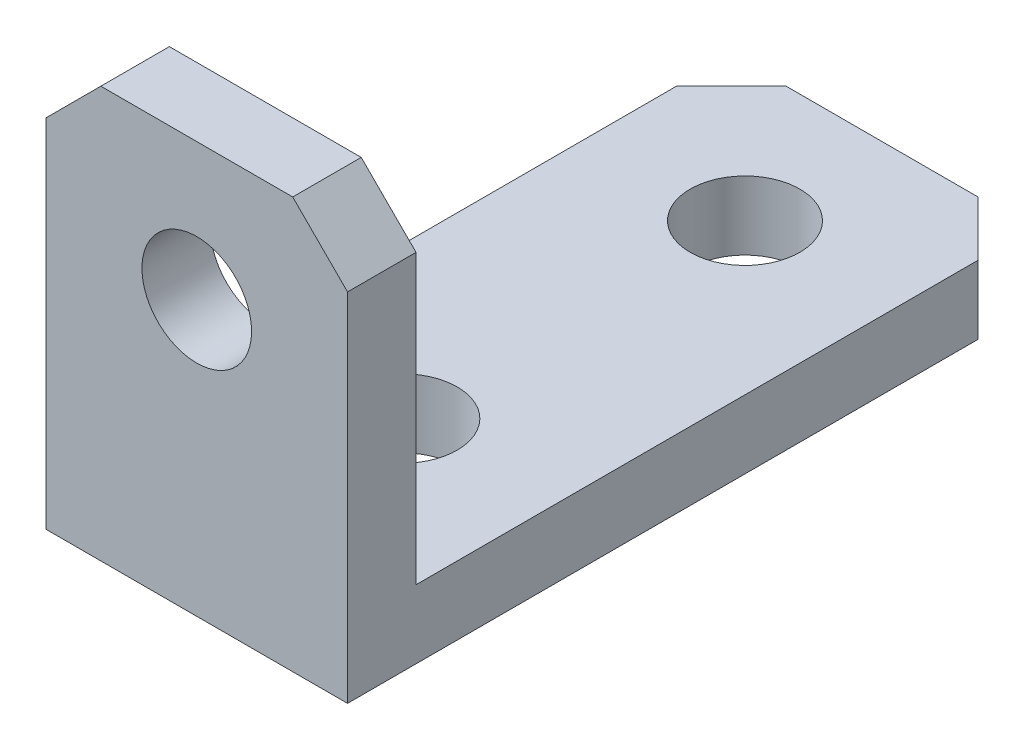
ISO-10303-21;
HEADER;
FILE_DESCRIPTION(('STEP AP214'),'2;1');
FILE_NAME('part.step','',(''),(''),'','','');
FILE_SCHEMA(('AUTOMOTIVE_DESIGN { 1 0 10303 214 1 1 1 1 }'));
ENDSEC;
DATA;
#1=APPLICATION_CONTEXT('core data for automotive mechanical design processes');
#2=APPLICATION_PROTOCOL_DEFINITION('international standard','automotive_design',2000,#1);
#3=PRODUCT_CONTEXT('',#1,'mechanical');
#4=PRODUCT('Part','Part','',(#3));
#5=PRODUCT_RELATED_PRODUCT_CATEGORY('part','',(#4));
#6=PRODUCT_DEFINITION_FORMATION('','',#4);
#7=PRODUCT_DEFINITION_CONTEXT('part definition',#1,'design');
#8=PRODUCT_DEFINITION('design','',#6,#7);
#9=PRODUCT_DEFINITION_SHAPE('','',#8);
#10=(LENGTH_UNIT() NAMED_UNIT(*) SI_UNIT(.MILLI.,.METRE.));
#11=(NAMED_UNIT(*) PLANE_ANGLE_UNIT() SI_UNIT($,.RADIAN.));
#12=(NAMED_UNIT(*) SI_UNIT($,.STERADIAN.) SOLID_ANGLE_UNIT());
#13=UNCERTAINTY_MEASURE_WITH_UNIT(LENGTH_MEASURE(1.E-05),#10,'distance_accuracy_value','');
#14=(GEOMETRIC_REPRESENTATION_CONTEXT(3) GLOBAL_UNCERTAINTY_ASSIGNED_CONTEXT((#13)) GLOBAL_UNIT_ASSIGNED_CONTEXT((#10,
#11,#12)) REPRESENTATION_CONTEXT('',''));
#15=CARTESIAN_POINT('',(0.,0.,0.));
#16=DIRECTION('',(0.,0.,1.));
#17=DIRECTION('',(1.,0.,0.));
#18=AXIS2_PLACEMENT_3D('',#15,#16,#17);
#19=CARTESIAN_POINT('',(0.,5.,0.));
#20=DIRECTION('',(0.,1.,0.));
#21=DIRECTION('',(0.,0.,1.));
#22=AXIS2_PLACEMENT_3D('',#19,#20,#21);
#23=PLANE('',#22);
#24=CARTESIAN_POINT('',(-2.01587301587299,5.,-11.1111111111111));
#25=DIRECTION('',(0.,1.,0.));
#26=DIRECTION('',(0.,0.,1.));
#27=AXIS2_PLACEMENT_3D('',#24,#25,#26);
#28=CIRCLE('',#27,4.);
#29=CARTESIAN_POINT('',(-2.01587301587299,5.,-7.1111111111111));
#30=VERTEX_POINT('',#29);
#31=EDGE_CURVE('E153',#30,#30,#28,.T.);
#32=ORIENTED_EDGE('',*,*,#31,.F.);
#33=EDGE_LOOP('',(#32));
#34=FACE_BOUND('',#33,.T.);
#35=CARTESIAN_POINT('',(-2.01587301587299,5.,13.8888888888889));
#36=DIRECTION('',(0.,1.,0.));
#37=DIRECTION('',(0.,0.,1.));
#38=AXIS2_PLACEMENT_3D('',#35,#36,#37);
#39=CIRCLE('',#38,4.);
#40=CARTESIAN_POINT('',(-2.01587301587299,5.,17.8888888888889));
#41=VERTEX_POINT('',#40);
#42=EDGE_CURVE('E147',#41,#41,#39,.T.);
#43=ORIENTED_EDGE('',*,*,#42,.F.);
#44=EDGE_LOOP('',(#43));
#45=FACE_BOUND('',#44,.T.);
#46=DIRECTION('',(-1.,0.,0.));
#47=VECTOR('',#46,1.);
#48=CARTESIAN_POINT('',(-13.015873015873,5.,-21.1111111111111));
#49=LINE('',#48,#47);
#50=CARTESIAN_POINT('',(4.98412698412702,5.,-21.1111111111111));
#51=VERTEX_POINT('',#50);
#52=CARTESIAN_POINT('',(-9.01587301587299,5.,-21.1111111111111));
#53=VERTEX_POINT('',#52);
#54=EDGE_CURVE('E160',#51,#53,#49,.T.);
#55=ORIENTED_EDGE('',*,*,#54,.T.);
#56=DIRECTION('',(0.707106781186549,0.,-0.707106781186546));
#57=VECTOR('',#56,1.);
#58=CARTESIAN_POINT('',(-15.063492063492,5.,-15.0634920634921));
#59=LINE('',#58,#57);
#60=CARTESIAN_POINT('',(-13.015873015873,5.,-17.1111111111111));
#61=VERTEX_POINT('',#60);
#62=EDGE_CURVE('E120',#53,#61,#59,.F.);
#63=ORIENTED_EDGE('',*,*,#62,.T.);
#64=DIRECTION('',(0.,0.,1.));
#65=VECTOR('',#64,1.);
#66=CARTESIAN_POINT('',(-13.015873015873,5.,-21.1111111111111));
#67=LINE('',#66,#65);
#68=CARTESIAN_POINT('',(-13.015873015873,5.,23.8888888888889));
#69=VERTEX_POINT('',#68);
#70=EDGE_CURVE('E112',#61,#69,#67,.T.);
#71=ORIENTED_EDGE('',*,*,#70,.T.);
#72=DIRECTION('',(1.,0.,0.));
#73=VECTOR('',#72,1.);
#74=CARTESIAN_POINT('',(-13.015873015873,5.,23.8888888888889));
#75=LINE('',#74,#73);
#76=CARTESIAN_POINT('',(8.98412698412701,5.,23.8888888888889));
#77=VERTEX_POINT('',#76);
#78=EDGE_CURVE('E117',#69,#77,#75,.T.);
#79=ORIENTED_EDGE('',*,*,#78,.T.);
#80=DIRECTION('',(0.,0.,-1.));
#81=VECTOR('',#80,1.);
#82=CARTESIAN_POINT('',(8.98412698412702,5.,-21.1111111111111));
#83=LINE('',#82,#81);
#84=CARTESIAN_POINT('',(8.98412698412702,5.,-17.1111111111111));
#85=VERTEX_POINT('',#84);
#86=EDGE_CURVE('E124',#77,#85,#83,.T.);
#87=ORIENTED_EDGE('',*,*,#86,.T.);
#88=DIRECTION('',(0.707106781186546,0.,0.707106781186549));
#89=VECTOR('',#88,1.);
#90=CARTESIAN_POINT('',(13.0476190476191,5.,-13.047619047619));
#91=LINE('',#90,#89);
#92=EDGE_CURVE('E188',#85,#51,#91,.F.);
#93=ORIENTED_EDGE('',*,*,#92,.T.);
#94=EDGE_LOOP('',(#55,#63,#71,#79,#87,#93));
#95=FACE_BOUND('',#94,.T.);
#96=ADVANCED_FACE('F35',(#34,#45,#95),#23,.T.);
#97=CARTESIAN_POINT('',(0.,0.,0.));
#98=DIRECTION('',(0.,1.,0.));
#99=DIRECTION('',(0.,0.,1.));
#100=AXIS2_PLACEMENT_3D('',#97,#98,#99);
#101=PLANE('',#100);
#102=DIRECTION('',(0.,0.,1.));
#103=VECTOR('',#102,1.);
#104=CARTESIAN_POINT('',(-13.015873015873,0.,-21.1111111111111));
#105=LINE('',#104,#103);
#106=CARTESIAN_POINT('',(-13.015873015873,0.,-17.1111111111111));
#107=VERTEX_POINT('',#106);
#108=CARTESIAN_POINT('',(-13.015873015873,0.,28.8888888888889));
#109=VERTEX_POINT('',#108);
#110=EDGE_CURVE('E156',#107,#109,#105,.T.);
#111=ORIENTED_EDGE('',*,*,#110,.F.);
#112=DIRECTION('',(-0.707106781186549,0.,0.707106781186546));
#113=VECTOR('',#112,1.);
#114=CARTESIAN_POINT('',(-13.015873015873,0.,-17.1111111111111));
#115=LINE('',#114,#113);
#116=CARTESIAN_POINT('',(-9.01587301587299,0.,-21.1111111111111));
#117=VERTEX_POINT('',#116);
#118=EDGE_CURVE('E181',#107,#117,#115,.F.);
#119=ORIENTED_EDGE('',*,*,#118,.T.);
#120=DIRECTION('',(-1.,0.,0.));
#121=VECTOR('',#120,1.);
#122=CARTESIAN_POINT('',(-13.015873015873,0.,-21.1111111111111));
#123=LINE('',#122,#121);
#124=CARTESIAN_POINT('',(4.98412698412702,0.,-21.1111111111111));
#125=VERTEX_POINT('',#124);
#126=EDGE_CURVE('E125',#125,#117,#123,.T.);
#127=ORIENTED_EDGE('',*,*,#126,.F.);
#128=DIRECTION('',(-0.707106781186546,0.,-0.707106781186549));
#129=VECTOR('',#128,1.);
#130=CARTESIAN_POINT('',(4.98412698412702,0.,-21.1111111111111));
#131=LINE('',#130,#129);
#132=CARTESIAN_POINT('',(8.98412698412702,0.,-17.1111111111111));
#133=VERTEX_POINT('',#132);
#134=EDGE_CURVE('E179',#125,#133,#131,.F.);
#135=ORIENTED_EDGE('',*,*,#134,.T.);
#136=DIRECTION('',(0.,0.,-1.));
#137=VECTOR('',#136,1.);
#138=CARTESIAN_POINT('',(8.98412698412702,0.,-21.1111111111111));
#139=LINE('',#138,#137);
#140=CARTESIAN_POINT('',(8.98412698412701,0.,28.8888888888889));
#141=VERTEX_POINT('',#140);
#142=EDGE_CURVE('E168',#141,#133,#139,.T.);
#143=ORIENTED_EDGE('',*,*,#142,.F.);
#144=DIRECTION('',(1.,0.,0.));
#145=VECTOR('',#144,1.);
#146=CARTESIAN_POINT('',(-13.015873015873,0.,28.8888888888889));
#147=LINE('',#146,#145);
#148=EDGE_CURVE('E165',#109,#141,#147,.T.);
#149=ORIENTED_EDGE('',*,*,#148,.F.);
#150=EDGE_LOOP('',(#111,#119,#127,#135,#143,#149));
#151=FACE_BOUND('',#150,.T.);
#152=CARTESIAN_POINT('',(-2.01587301587299,0.,-11.1111111111111));
#153=DIRECTION('',(0.,1.,0.));
#154=DIRECTION('',(0.,0.,1.));
#155=AXIS2_PLACEMENT_3D('',#152,#153,#154);
#156=CIRCLE('',#155,4.);
#157=CARTESIAN_POINT('',(-2.01587301587299,0.,-7.1111111111111));
#158=VERTEX_POINT('',#157);
#159=EDGE_CURVE('E150',#158,#158,#156,.T.);
#160=ORIENTED_EDGE('',*,*,#159,.T.);
#161=EDGE_LOOP('',(#160));
#162=FACE_BOUND('',#161,.T.);
#163=CARTESIAN_POINT('',(-2.01587301587299,0.,13.8888888888889));
#164=DIRECTION('',(0.,1.,0.));
#165=DIRECTION('',(0.,0.,1.));
#166=AXIS2_PLACEMENT_3D('',#163,#164,#165);
#167=CIRCLE('',#166,4.);
#168=CARTESIAN_POINT('',(-2.01587301587299,0.,17.8888888888889));
#169=VERTEX_POINT('',#168);
#170=EDGE_CURVE('E143',#169,#169,#167,.T.);
#171=ORIENTED_EDGE('',*,*,#170,.T.);
#172=EDGE_LOOP('',(#171));
#173=FACE_BOUND('',#172,.T.);
#174=ADVANCED_FACE('F220',(#151,#162,#173),#101,.F.);
#175=CARTESIAN_POINT('',(-13.015873015873,5.,-21.1111111111111));
#176=DIRECTION('',(1.,0.,0.));
#177=DIRECTION('',(0.,0.,-1.));
#178=AXIS2_PLACEMENT_3D('',#175,#176,#177);
#179=PLANE('',#178);
#180=ORIENTED_EDGE('',*,*,#70,.F.);
#181=DIRECTION('',(0.,-1.,0.));
#182=VECTOR('',#181,1.);
#183=CARTESIAN_POINT('',(-13.015873015873,5.,-17.1111111111111));
#184=LINE('',#183,#182);
#185=EDGE_CURVE('E177',#61,#107,#184,.T.);
#186=ORIENTED_EDGE('',*,*,#185,.T.);
#187=ORIENTED_EDGE('',*,*,#110,.T.);
#188=DIRECTION('',(0.,-1.,0.));
#189=VECTOR('',#188,1.);
#190=CARTESIAN_POINT('',(-13.015873015873,5.,28.8888888888889));
#191=LINE('',#190,#189);
#192=CARTESIAN_POINT('',(-13.015873015873,26.,28.8888888888889));
#193=VERTEX_POINT('',#192);
#194=EDGE_CURVE('E174',#193,#109,#191,.T.);
#195=ORIENTED_EDGE('',*,*,#194,.F.);
#196=DIRECTION('',(0.,0.,-1.));
#197=VECTOR('',#196,1.);
#198=CARTESIAN_POINT('',(-13.015873015873,26.,23.8888888888889));
#199=LINE('',#198,#197);
#200=CARTESIAN_POINT('',(-13.015873015873,26.,23.8888888888889));
#201=VERTEX_POINT('',#200);
#202=EDGE_CURVE('E131',#193,#201,#199,.T.);
#203=ORIENTED_EDGE('',*,*,#202,.T.);
#204=DIRECTION('',(0.,-1.,0.));
#205=VECTOR('',#204,1.);
#206=CARTESIAN_POINT('',(-13.015873015873,30.,23.8888888888889));
#207=LINE('',#206,#205);
#208=EDGE_CURVE('E127',#201,#69,#207,.T.);
#209=ORIENTED_EDGE('',*,*,#208,.T.);
#210=EDGE_LOOP('',(#180,#186,#187,#195,#203,#209));
#211=FACE_BOUND('',#210,.T.);
#212=ADVANCED_FACE('F128',(#211),#179,.F.);
#213=CARTESIAN_POINT('',(-13.015873015873,5.,28.8888888888889));
#214=DIRECTION('',(0.,0.,-1.));
#215=DIRECTION('',(-1.,0.,0.));
#216=AXIS2_PLACEMENT_3D('',#213,#214,#215);
#217=PLANE('',#216);
#218=DIRECTION('',(-1.,0.,0.));
#219=VECTOR('',#218,1.);
#220=CARTESIAN_POINT('',(8.98412698412701,30.,28.8888888888889));
#221=LINE('',#220,#219);
#222=CARTESIAN_POINT('',(4.984126984127,30.,28.8888888888889));
#223=VERTEX_POINT('',#222);
#224=CARTESIAN_POINT('',(-9.015873015873,30.,28.8888888888889));
#225=VERTEX_POINT('',#224);
#226=EDGE_CURVE('E132',#223,#225,#221,.T.);
#227=ORIENTED_EDGE('',*,*,#226,.T.);
#228=DIRECTION('',(-0.707106781186546,-0.707106781186549,0.));
#229=VECTOR('',#228,1.);
#230=CARTESIAN_POINT('',(-9.015873015873,30.,28.8888888888889));
#231=LINE('',#230,#229);
#232=EDGE_CURVE('E202',#225,#193,#231,.T.);
#233=ORIENTED_EDGE('',*,*,#232,.T.);
#234=ORIENTED_EDGE('',*,*,#194,.T.);
#235=ORIENTED_EDGE('',*,*,#148,.T.);
#236=DIRECTION('',(0.,-1.,0.));
#237=VECTOR('',#236,1.);
#238=CARTESIAN_POINT('',(8.98412698412701,5.,28.8888888888889));
#239=LINE('',#238,#237);
#240=CARTESIAN_POINT('',(8.98412698412701,26.,28.8888888888889));
#241=VERTEX_POINT('',#240);
#242=EDGE_CURVE('E162',#241,#141,#239,.T.);
#243=ORIENTED_EDGE('',*,*,#242,.F.);
#244=DIRECTION('',(-0.707106781186549,0.707106781186546,0.));
#245=VECTOR('',#244,1.);
#246=CARTESIAN_POINT('',(8.98412698412701,26.,28.8888888888889));
#247=LINE('',#246,#245);
#248=EDGE_CURVE('E200',#241,#223,#247,.T.);
#249=ORIENTED_EDGE('',*,*,#248,.T.);
#250=EDGE_LOOP('',(#227,#233,#234,#235,#243,#249));
#251=FACE_BOUND('',#250,.T.);
#252=CARTESIAN_POINT('',(-2.01587301587299,20.,28.8888888888889));
#253=DIRECTION('',(0.,0.,1.));
#254=DIRECTION('',(1.,0.,0.));
#255=AXIS2_PLACEMENT_3D('',#252,#253,#254);
#256=CIRCLE('',#255,4.);
#257=CARTESIAN_POINT('',(1.98412698412701,20.,28.8888888888889));
#258=VERTEX_POINT('',#257);
#259=EDGE_CURVE('E373',#258,#258,#256,.T.);
#260=ORIENTED_EDGE('',*,*,#259,.F.);
#261=EDGE_LOOP('',(#260));
#262=FACE_BOUND('',#261,.T.);
#263=ADVANCED_FACE('F210',(#251,#262),#217,.F.);
#264=CARTESIAN_POINT('',(8.98412698412702,5.,-21.1111111111111));
#265=DIRECTION('',(-1.,0.,0.));
#266=DIRECTION('',(0.,0.,1.));
#267=AXIS2_PLACEMENT_3D('',#264,#265,#266);
#268=PLANE('',#267);
#269=ORIENTED_EDGE('',*,*,#142,.T.);
#270=DIRECTION('',(0.,1.,0.));
#271=VECTOR('',#270,1.);
#272=CARTESIAN_POINT('',(8.98412698412702,5.,-17.1111111111111));
#273=LINE('',#272,#271);
#274=EDGE_CURVE('E194',#133,#85,#273,.T.);
#275=ORIENTED_EDGE('',*,*,#274,.T.);
#276=ORIENTED_EDGE('',*,*,#86,.F.);
#277=DIRECTION('',(0.,1.,0.));
#278=VECTOR('',#277,1.);
#279=CARTESIAN_POINT('',(8.98412698412701,5.,23.8888888888889));
#280=LINE('',#279,#278);
#281=CARTESIAN_POINT('',(8.98412698412701,26.,23.8888888888889));
#282=VERTEX_POINT('',#281);
#283=EDGE_CURVE('E136',#77,#282,#280,.T.);
#284=ORIENTED_EDGE('',*,*,#283,.T.);
#285=DIRECTION('',(0.,0.,1.));
#286=VECTOR('',#285,1.);
#287=CARTESIAN_POINT('',(8.98412698412701,26.,28.8888888888889));
#288=LINE('',#287,#286);
#289=EDGE_CURVE('E191',#282,#241,#288,.T.);
#290=ORIENTED_EDGE('',*,*,#289,.T.);
#291=ORIENTED_EDGE('',*,*,#242,.T.);
#292=EDGE_LOOP('',(#269,#275,#276,#284,#290,#291));
#293=FACE_BOUND('',#292,.T.);
#294=ADVANCED_FACE('F207',(#293),#268,.F.);
#295=CARTESIAN_POINT('',(-13.015873015873,5.,-21.1111111111111));
#296=DIRECTION('',(0.,0.,1.));
#297=DIRECTION('',(1.,0.,0.));
#298=AXIS2_PLACEMENT_3D('',#295,#296,#297);
#299=PLANE('',#298);
#300=ORIENTED_EDGE('',*,*,#126,.T.);
#301=DIRECTION('',(0.,1.,0.));
#302=VECTOR('',#301,1.);
#303=CARTESIAN_POINT('',(-9.01587301587299,5.,-21.1111111111111));
#304=LINE('',#303,#302);
#305=EDGE_CURVE('E186',#117,#53,#304,.T.);
#306=ORIENTED_EDGE('',*,*,#305,.T.);
#307=ORIENTED_EDGE('',*,*,#54,.F.);
#308=DIRECTION('',(0.,-1.,0.));
#309=VECTOR('',#308,1.);
#310=CARTESIAN_POINT('',(4.98412698412702,5.,-21.1111111111111));
#311=LINE('',#310,#309);
#312=EDGE_CURVE('E183',#51,#125,#311,.T.);
#313=ORIENTED_EDGE('',*,*,#312,.T.);
#314=EDGE_LOOP('',(#300,#306,#307,#313));
#315=FACE_BOUND('',#314,.T.);
#316=ADVANCED_FACE('F230',(#315),#299,.F.);
#317=CARTESIAN_POINT('',(-2.01587301587299,5.,-11.1111111111111));
#318=DIRECTION('',(0.,-1.,0.));
#319=DIRECTION('',(0.,0.,-1.));
#320=AXIS2_PLACEMENT_3D('',#317,#318,#319);
#321=CYLINDRICAL_SURFACE('',#320,4.);
#322=ORIENTED_EDGE('',*,*,#31,.T.);
#323=EDGE_LOOP('',(#322));
#324=FACE_BOUND('',#323,.T.);
#325=ORIENTED_EDGE('',*,*,#159,.F.);
#326=EDGE_LOOP('',(#325));
#327=FACE_BOUND('',#326,.T.);
#328=ADVANCED_FACE('F255',(#324,#327),#321,.F.);
#329=CARTESIAN_POINT('',(-2.01587301587299,5.,13.8888888888889));
#330=DIRECTION('',(0.,-1.,0.));
#331=DIRECTION('',(0.,0.,-1.));
#332=AXIS2_PLACEMENT_3D('',#329,#330,#331);
#333=CYLINDRICAL_SURFACE('',#332,4.);
#334=ORIENTED_EDGE('',*,*,#42,.T.);
#335=EDGE_LOOP('',(#334));
#336=FACE_BOUND('',#335,.T.);
#337=ORIENTED_EDGE('',*,*,#170,.F.);
#338=EDGE_LOOP('',(#337));
#339=FACE_BOUND('',#338,.T.);
#340=ADVANCED_FACE('F287',(#336,#339),#333,.F.);
#341=CARTESIAN_POINT('',(8.98412698412701,30.,23.8888888888889));
#342=DIRECTION('',(0.,1.,0.));
#343=DIRECTION('',(-1.,0.,0.));
#344=AXIS2_PLACEMENT_3D('',#341,#342,#343);
#345=PLANE('',#344);
#346=DIRECTION('',(-1.,0.,0.));
#347=VECTOR('',#346,1.);
#348=CARTESIAN_POINT('',(8.98412698412701,30.,23.8888888888889));
#349=LINE('',#348,#347);
#350=CARTESIAN_POINT('',(4.984126984127,30.,23.8888888888889));
#351=VERTEX_POINT('',#350);
#352=CARTESIAN_POINT('',(-9.015873015873,30.,23.8888888888889));
#353=VERTEX_POINT('',#352);
#354=EDGE_CURVE('E138',#351,#353,#349,.T.);
#355=ORIENTED_EDGE('',*,*,#354,.T.);
#356=DIRECTION('',(0.,0.,1.));
#357=VECTOR('',#356,1.);
#358=CARTESIAN_POINT('',(-9.01587301587299,30.,28.8888888888889));
#359=LINE('',#358,#357);
#360=EDGE_CURVE('E197',#353,#225,#359,.T.);
#361=ORIENTED_EDGE('',*,*,#360,.T.);
#362=ORIENTED_EDGE('',*,*,#226,.F.);
#363=DIRECTION('',(0.,0.,-1.));
#364=VECTOR('',#363,1.);
#365=CARTESIAN_POINT('',(4.984126984127,30.,23.8888888888889));
#366=LINE('',#365,#364);
#367=EDGE_CURVE('E55',#223,#351,#366,.T.);
#368=ORIENTED_EDGE('',*,*,#367,.T.);
#369=EDGE_LOOP('',(#355,#361,#362,#368));
#370=FACE_BOUND('',#369,.T.);
#371=ADVANCED_FACE('F212',(#370),#345,.T.);
#372=CARTESIAN_POINT('',(0.,0.,23.8888888888889));
#373=DIRECTION('',(0.,0.,1.));
#374=DIRECTION('',(1.,0.,0.));
#375=AXIS2_PLACEMENT_3D('',#372,#373,#374);
#376=PLANE('',#375);
#377=CARTESIAN_POINT('',(-2.01587301587299,20.,23.8888888888889));
#378=DIRECTION('',(0.,0.,1.));
#379=DIRECTION('',(1.,0.,0.));
#380=AXIS2_PLACEMENT_3D('',#377,#378,#379);
#381=CIRCLE('',#380,4.);
#382=CARTESIAN_POINT('',(1.98412698412701,20.,23.8888888888889));
#383=VERTEX_POINT('',#382);
#384=EDGE_CURVE('E146',#383,#383,#381,.T.);
#385=ORIENTED_EDGE('',*,*,#384,.T.);
#386=EDGE_LOOP('',(#385));
#387=FACE_BOUND('',#386,.T.);
#388=ORIENTED_EDGE('',*,*,#208,.F.);
#389=DIRECTION('',(0.707106781186546,0.707106781186549,0.));
#390=VECTOR('',#389,1.);
#391=CARTESIAN_POINT('',(-9.015873015873,30.,23.8888888888889));
#392=LINE('',#391,#390);
#393=EDGE_CURVE('E11',#201,#353,#392,.T.);
#394=ORIENTED_EDGE('',*,*,#393,.T.);
#395=ORIENTED_EDGE('',*,*,#354,.F.);
#396=DIRECTION('',(0.707106781186549,-0.707106781186546,0.));
#397=VECTOR('',#396,1.);
#398=CARTESIAN_POINT('',(8.98412698412701,26.,23.8888888888889));
#399=LINE('',#398,#397);
#400=EDGE_CURVE('E43',#351,#282,#399,.T.);
#401=ORIENTED_EDGE('',*,*,#400,.T.);
#402=ORIENTED_EDGE('',*,*,#283,.F.);
#403=ORIENTED_EDGE('',*,*,#78,.F.);
#404=EDGE_LOOP('',(#388,#394,#395,#401,#402,#403));
#405=FACE_BOUND('',#404,.T.);
#406=ADVANCED_FACE('F134',(#387,#405),#376,.F.);
#407=CARTESIAN_POINT('',(-2.01587301587299,20.,23.8888888888889));
#408=DIRECTION('',(0.,0.,1.));
#409=DIRECTION('',(1.,0.,0.));
#410=AXIS2_PLACEMENT_3D('',#407,#408,#409);
#411=CYLINDRICAL_SURFACE('',#410,4.);
#412=ORIENTED_EDGE('',*,*,#384,.F.);
#413=EDGE_LOOP('',(#412));
#414=FACE_BOUND('',#413,.T.);
#415=ORIENTED_EDGE('',*,*,#259,.T.);
#416=EDGE_LOOP('',(#415));
#417=FACE_BOUND('',#416,.T.);
#418=ADVANCED_FACE('F235',(#414,#417),#411,.F.);
#419=CARTESIAN_POINT('',(-13.015873015873,5.,-17.1111111111111));
#420=DIRECTION('',(0.707106781186546,0.,0.707106781186549));
#421=DIRECTION('',(0.,-1.,0.));
#422=AXIS2_PLACEMENT_3D('',#419,#420,#421);
#423=PLANE('',#422);
#424=ORIENTED_EDGE('',*,*,#62,.F.);
#425=ORIENTED_EDGE('',*,*,#305,.F.);
#426=ORIENTED_EDGE('',*,*,#118,.F.);
#427=ORIENTED_EDGE('',*,*,#185,.F.);
#428=EDGE_LOOP('',(#424,#425,#426,#427));
#429=FACE_BOUND('',#428,.T.);
#430=ADVANCED_FACE('F233',(#429),#423,.F.);
#431=CARTESIAN_POINT('',(4.98412698412702,5.,-21.1111111111111));
#432=DIRECTION('',(-0.707106781186549,0.,0.707106781186546));
#433=DIRECTION('',(0.,-1.,0.));
#434=AXIS2_PLACEMENT_3D('',#431,#432,#433);
#435=PLANE('',#434);
#436=ORIENTED_EDGE('',*,*,#92,.F.);
#437=ORIENTED_EDGE('',*,*,#274,.F.);
#438=ORIENTED_EDGE('',*,*,#134,.F.);
#439=ORIENTED_EDGE('',*,*,#312,.F.);
#440=EDGE_LOOP('',(#436,#437,#438,#439));
#441=FACE_BOUND('',#440,.T.);
#442=ADVANCED_FACE('F226',(#441),#435,.F.);
#443=CARTESIAN_POINT('',(-9.015873015873,30.,23.8888888888889));
#444=DIRECTION('',(-0.707106781186549,0.707106781186546,0.));
#445=DIRECTION('',(0.,0.,-1.));
#446=AXIS2_PLACEMENT_3D('',#443,#444,#445);
#447=PLANE('',#446);
#448=ORIENTED_EDGE('',*,*,#393,.F.);
#449=ORIENTED_EDGE('',*,*,#202,.F.);
#450=ORIENTED_EDGE('',*,*,#232,.F.);
#451=ORIENTED_EDGE('',*,*,#360,.F.);
#452=EDGE_LOOP('',(#448,#449,#450,#451));
#453=FACE_BOUND('',#452,.T.);
#454=ADVANCED_FACE('F215',(#453),#447,.T.);
#455=CARTESIAN_POINT('',(8.98412698412702,26.,-21.1111111111111));
#456=DIRECTION('',(0.707106781186546,0.707106781186549,0.));
#457=DIRECTION('',(0.,0.,-1.));
#458=AXIS2_PLACEMENT_3D('',#455,#456,#457);
#459=PLANE('',#458);
#460=ORIENTED_EDGE('',*,*,#400,.F.);
#461=ORIENTED_EDGE('',*,*,#367,.F.);
#462=ORIENTED_EDGE('',*,*,#248,.F.);
#463=ORIENTED_EDGE('',*,*,#289,.F.);
#464=EDGE_LOOP('',(#460,#461,#462,#463));
#465=FACE_BOUND('',#464,.T.);
#466=ADVANCED_FACE('F37',(#465),#459,.T.);
#467=CLOSED_SHELL('',(#96,#174,#212,#263,#294,#316,#328,#340,#371,#406,#418,#430,#442,#454,#466));
#468=MANIFOLD_SOLID_BREP('B2',#467);
#469=ADVANCED_BREP_SHAPE_REPRESENTATION('',(#18,#468),#14);
#470=SHAPE_DEFINITION_REPRESENTATION(#9,#469);
ENDSEC;
END-ISO-10303-21;
